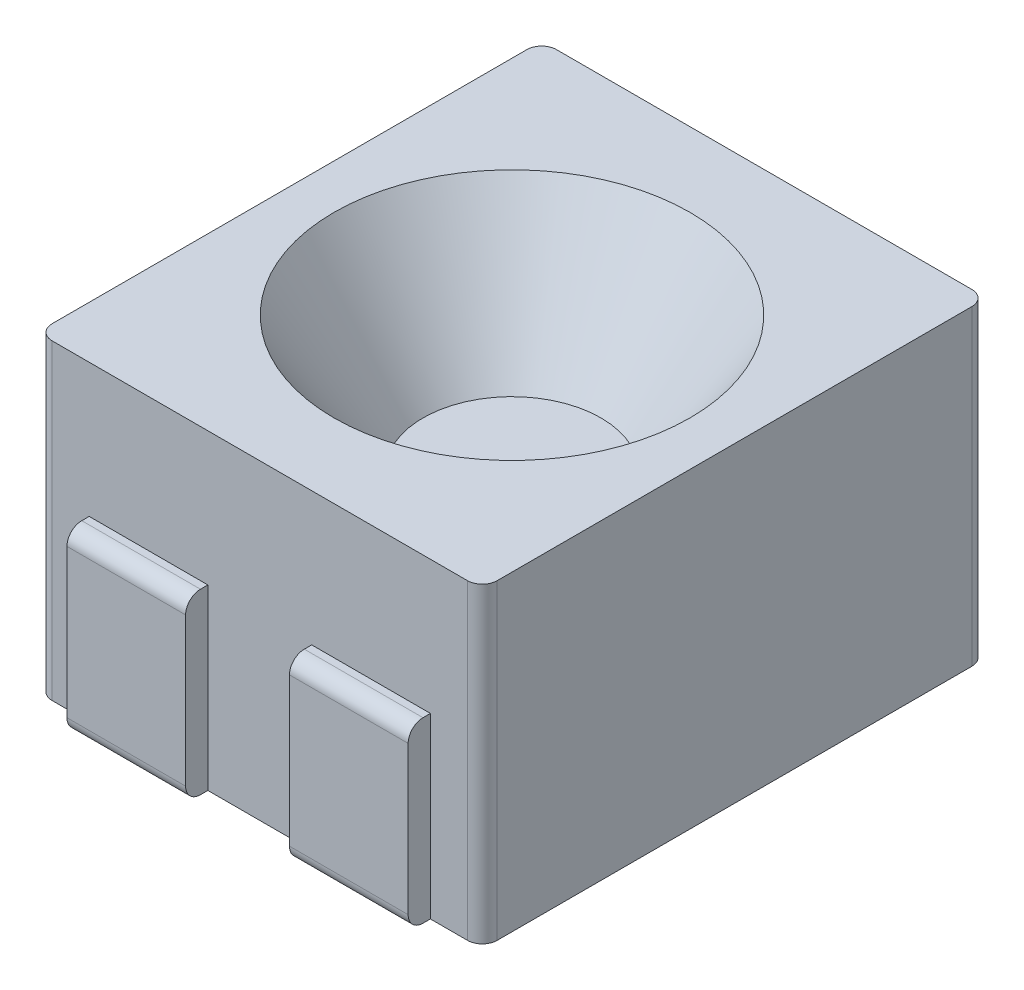
ISO-10303-21;
HEADER;
FILE_DESCRIPTION(('STEP AP214'),'2;1');
FILE_NAME('part.step','',(''),(''),'','','');
FILE_SCHEMA(('AUTOMOTIVE_DESIGN { 1 0 10303 214 1 1 1 1 }'));
ENDSEC;
DATA;
#1=APPLICATION_CONTEXT('core data for automotive mechanical design processes');
#2=APPLICATION_PROTOCOL_DEFINITION('international standard','automotive_design',2000,#1);
#3=PRODUCT_CONTEXT('',#1,'mechanical');
#4=PRODUCT('Part','Part','',(#3));
#5=PRODUCT_RELATED_PRODUCT_CATEGORY('part','',(#4));
#6=PRODUCT_DEFINITION_FORMATION('','',#4);
#7=PRODUCT_DEFINITION_CONTEXT('part definition',#1,'design');
#8=PRODUCT_DEFINITION('design','',#6,#7);
#9=PRODUCT_DEFINITION_SHAPE('','',#8);
#10=(LENGTH_UNIT() NAMED_UNIT(*) SI_UNIT(.MILLI.,.METRE.));
#11=(NAMED_UNIT(*) PLANE_ANGLE_UNIT() SI_UNIT($,.RADIAN.));
#12=(NAMED_UNIT(*) SI_UNIT($,.STERADIAN.) SOLID_ANGLE_UNIT());
#13=UNCERTAINTY_MEASURE_WITH_UNIT(LENGTH_MEASURE(1.E-05),#10,'distance_accuracy_value','');
#14=(GEOMETRIC_REPRESENTATION_CONTEXT(3) GLOBAL_UNCERTAINTY_ASSIGNED_CONTEXT((#13)) GLOBAL_UNIT_ASSIGNED_CONTEXT((#10,
#11,#12)) REPRESENTATION_CONTEXT('',''));
#15=CARTESIAN_POINT('',(0.,0.,0.));
#16=DIRECTION('',(0.,0.,1.));
#17=DIRECTION('',(1.,0.,0.));
#18=AXIS2_PLACEMENT_3D('',#15,#16,#17);
#19=CARTESIAN_POINT('',(-1.5,2.1,-1.7));
#20=DIRECTION('',(0.,0.,1.));
#21=DIRECTION('',(1.,0.,0.));
#22=AXIS2_PLACEMENT_3D('',#19,#20,#21);
#23=PLANE('',#22);
#24=DIRECTION('',(-1.,0.,0.));
#25=VECTOR('',#24,1.);
#26=CARTESIAN_POINT('',(-1.5,0.,-1.7));
#27=LINE('',#26,#25);
#28=CARTESIAN_POINT('',(-1.15,0.,-1.7));
#29=VERTEX_POINT('',#28);
#30=CARTESIAN_POINT('',(-1.4,0.,-1.7));
#31=VERTEX_POINT('',#30);
#32=EDGE_CURVE('E259',#29,#31,#27,.T.);
#33=ORIENTED_EDGE('',*,*,#32,.T.);
#34=DIRECTION('',(0.,-1.,0.));
#35=VECTOR('',#34,1.);
#36=CARTESIAN_POINT('',(-1.4,2.1,-1.7));
#37=LINE('',#36,#35);
#38=CARTESIAN_POINT('',(-1.4,2.1,-1.7));
#39=VERTEX_POINT('',#38);
#40=EDGE_CURVE('E502',#31,#39,#37,.F.);
#41=ORIENTED_EDGE('',*,*,#40,.T.);
#42=DIRECTION('',(-1.,0.,0.));
#43=VECTOR('',#42,1.);
#44=CARTESIAN_POINT('',(-1.5,2.1,-1.7));
#45=LINE('',#44,#43);
#46=CARTESIAN_POINT('',(1.4,2.1,-1.7));
#47=VERTEX_POINT('',#46);
#48=EDGE_CURVE('E446',#47,#39,#45,.T.);
#49=ORIENTED_EDGE('',*,*,#48,.F.);
#50=DIRECTION('',(0.,-1.,0.));
#51=VECTOR('',#50,1.);
#52=CARTESIAN_POINT('',(1.4,2.1,-1.7));
#53=LINE('',#52,#51);
#54=CARTESIAN_POINT('',(1.4,0.,-1.7));
#55=VERTEX_POINT('',#54);
#56=EDGE_CURVE('E518',#47,#55,#53,.T.);
#57=ORIENTED_EDGE('',*,*,#56,.T.);
#58=CARTESIAN_POINT('',(1.15,0.,-1.7));
#59=VERTEX_POINT('',#58);
#60=EDGE_CURVE('E330',#55,#59,#27,.T.);
#61=ORIENTED_EDGE('',*,*,#60,.T.);
#62=DIRECTION('',(0.,-1.,0.));
#63=VECTOR('',#62,1.);
#64=CARTESIAN_POINT('',(1.15,0.,-1.7));
#65=LINE('',#64,#63);
#66=CARTESIAN_POINT('',(1.15,1.2,-1.7));
#67=VERTEX_POINT('',#66);
#68=EDGE_CURVE('E289',#67,#59,#65,.T.);
#69=ORIENTED_EDGE('',*,*,#68,.F.);
#70=DIRECTION('',(1.,0.,0.));
#71=VECTOR('',#70,1.);
#72=CARTESIAN_POINT('',(1.15,1.2,-1.7));
#73=LINE('',#72,#71);
#74=CARTESIAN_POINT('',(0.35,1.2,-1.7));
#75=VERTEX_POINT('',#74);
#76=EDGE_CURVE('E294',#75,#67,#73,.T.);
#77=ORIENTED_EDGE('',*,*,#76,.F.);
#78=DIRECTION('',(0.,1.,0.));
#79=VECTOR('',#78,1.);
#80=CARTESIAN_POINT('',(0.35,0.,-1.7));
#81=LINE('',#80,#79);
#82=CARTESIAN_POINT('',(0.35,0.,-1.7));
#83=VERTEX_POINT('',#82);
#84=EDGE_CURVE('E305',#83,#75,#81,.T.);
#85=ORIENTED_EDGE('',*,*,#84,.F.);
#86=CARTESIAN_POINT('',(-0.35,0.,-1.7));
#87=VERTEX_POINT('',#86);
#88=EDGE_CURVE('E265',#83,#87,#27,.T.);
#89=ORIENTED_EDGE('',*,*,#88,.T.);
#90=DIRECTION('',(0.,1.,0.));
#91=VECTOR('',#90,1.);
#92=CARTESIAN_POINT('',(-0.35,0.,-1.7));
#93=LINE('',#92,#91);
#94=CARTESIAN_POINT('',(-0.35,1.2,-1.7));
#95=VERTEX_POINT('',#94);
#96=EDGE_CURVE('E274',#87,#95,#93,.T.);
#97=ORIENTED_EDGE('',*,*,#96,.T.);
#98=DIRECTION('',(-1.,0.,0.));
#99=VECTOR('',#98,1.);
#100=CARTESIAN_POINT('',(-1.15,1.2,-1.7));
#101=LINE('',#100,#99);
#102=CARTESIAN_POINT('',(-1.15,1.2,-1.7));
#103=VERTEX_POINT('',#102);
#104=EDGE_CURVE('E271',#95,#103,#101,.T.);
#105=ORIENTED_EDGE('',*,*,#104,.T.);
#106=DIRECTION('',(0.,-1.,0.));
#107=VECTOR('',#106,1.);
#108=CARTESIAN_POINT('',(-1.15,0.,-1.7));
#109=LINE('',#108,#107);
#110=EDGE_CURVE('E249',#103,#29,#109,.T.);
#111=ORIENTED_EDGE('',*,*,#110,.T.);
#112=EDGE_LOOP('',(#33,#41,#49,#57,#61,#69,#77,#85,#89,#97,#105,#111));
#113=FACE_BOUND('',#112,.T.);
#114=ADVANCED_FACE('F32',(#113),#23,.F.);
#115=CARTESIAN_POINT('',(-1.5,2.1,1.7));
#116=DIRECTION('',(0.,0.,-1.));
#117=DIRECTION('',(-1.,0.,0.));
#118=AXIS2_PLACEMENT_3D('',#115,#116,#117);
#119=PLANE('',#118);
#120=DIRECTION('',(1.,0.,0.));
#121=VECTOR('',#120,1.);
#122=CARTESIAN_POINT('',(-1.5,2.1,1.7));
#123=LINE('',#122,#121);
#124=CARTESIAN_POINT('',(-1.4,2.1,1.7));
#125=VERTEX_POINT('',#124);
#126=CARTESIAN_POINT('',(1.4,2.1,1.7));
#127=VERTEX_POINT('',#126);
#128=EDGE_CURVE('E486',#125,#127,#123,.T.);
#129=ORIENTED_EDGE('',*,*,#128,.F.);
#130=DIRECTION('',(0.,-1.,0.));
#131=VECTOR('',#130,1.);
#132=CARTESIAN_POINT('',(-1.4,2.1,1.7));
#133=LINE('',#132,#131);
#134=CARTESIAN_POINT('',(-1.4,0.,1.7));
#135=VERTEX_POINT('',#134);
#136=EDGE_CURVE('E11',#125,#135,#133,.T.);
#137=ORIENTED_EDGE('',*,*,#136,.T.);
#138=DIRECTION('',(1.,0.,0.));
#139=VECTOR('',#138,1.);
#140=CARTESIAN_POINT('',(-1.5,0.,1.7));
#141=LINE('',#140,#139);
#142=CARTESIAN_POINT('',(-1.15,0.,1.7));
#143=VERTEX_POINT('',#142);
#144=EDGE_CURVE('E368',#135,#143,#141,.T.);
#145=ORIENTED_EDGE('',*,*,#144,.T.);
#146=DIRECTION('',(0.,-1.,0.));
#147=VECTOR('',#146,1.);
#148=CARTESIAN_POINT('',(-1.15,0.,1.7));
#149=LINE('',#148,#147);
#150=CARTESIAN_POINT('',(-1.15,1.2,1.7));
#151=VERTEX_POINT('',#150);
#152=EDGE_CURVE('E418',#151,#143,#149,.T.);
#153=ORIENTED_EDGE('',*,*,#152,.F.);
#154=DIRECTION('',(-1.,0.,0.));
#155=VECTOR('',#154,1.);
#156=CARTESIAN_POINT('',(-1.15,1.2,1.7));
#157=LINE('',#156,#155);
#158=CARTESIAN_POINT('',(-0.35,1.2,1.7));
#159=VERTEX_POINT('',#158);
#160=EDGE_CURVE('E431',#159,#151,#157,.T.);
#161=ORIENTED_EDGE('',*,*,#160,.F.);
#162=DIRECTION('',(0.,1.,0.));
#163=VECTOR('',#162,1.);
#164=CARTESIAN_POINT('',(-0.35,0.,1.7));
#165=LINE('',#164,#163);
#166=CARTESIAN_POINT('',(-0.35,0.,1.7));
#167=VERTEX_POINT('',#166);
#168=EDGE_CURVE('E421',#167,#159,#165,.T.);
#169=ORIENTED_EDGE('',*,*,#168,.F.);
#170=CARTESIAN_POINT('',(0.35,0.,1.7));
#171=VERTEX_POINT('',#170);
#172=EDGE_CURVE('E336',#167,#171,#141,.T.);
#173=ORIENTED_EDGE('',*,*,#172,.T.);
#174=DIRECTION('',(0.,1.,0.));
#175=VECTOR('',#174,1.);
#176=CARTESIAN_POINT('',(0.35,0.,1.7));
#177=LINE('',#176,#175);
#178=CARTESIAN_POINT('',(0.35,1.2,1.7));
#179=VERTEX_POINT('',#178);
#180=EDGE_CURVE('E556',#171,#179,#177,.T.);
#181=ORIENTED_EDGE('',*,*,#180,.T.);
#182=DIRECTION('',(1.,0.,0.));
#183=VECTOR('',#182,1.);
#184=CARTESIAN_POINT('',(1.15,1.2,1.7));
#185=LINE('',#184,#183);
#186=CARTESIAN_POINT('',(1.15,1.2,1.7));
#187=VERTEX_POINT('',#186);
#188=EDGE_CURVE('E561',#179,#187,#185,.T.);
#189=ORIENTED_EDGE('',*,*,#188,.T.);
#190=DIRECTION('',(0.,-1.,0.));
#191=VECTOR('',#190,1.);
#192=CARTESIAN_POINT('',(1.15,0.,1.7));
#193=LINE('',#192,#191);
#194=CARTESIAN_POINT('',(1.15,0.,1.7));
#195=VERTEX_POINT('',#194);
#196=EDGE_CURVE('E417',#187,#195,#193,.T.);
#197=ORIENTED_EDGE('',*,*,#196,.T.);
#198=CARTESIAN_POINT('',(1.4,0.,1.7));
#199=VERTEX_POINT('',#198);
#200=EDGE_CURVE('E378',#195,#199,#141,.T.);
#201=ORIENTED_EDGE('',*,*,#200,.T.);
#202=DIRECTION('',(0.,-1.,0.));
#203=VECTOR('',#202,1.);
#204=CARTESIAN_POINT('',(1.4,2.1,1.7));
#205=LINE('',#204,#203);
#206=EDGE_CURVE('E40',#199,#127,#205,.F.);
#207=ORIENTED_EDGE('',*,*,#206,.T.);
#208=EDGE_LOOP('',(#129,#137,#145,#153,#161,#169,#173,#181,#189,#197,#201,#207));
#209=FACE_BOUND('',#208,.T.);
#210=ADVANCED_FACE('F471',(#209),#119,.F.);
#211=CARTESIAN_POINT('',(-1.5,2.1,1.7));
#212=DIRECTION('',(1.,0.,0.));
#213=DIRECTION('',(0.,0.,-1.));
#214=AXIS2_PLACEMENT_3D('',#211,#212,#213);
#215=PLANE('',#214);
#216=DIRECTION('',(0.,0.,1.));
#217=VECTOR('',#216,1.);
#218=CARTESIAN_POINT('',(-1.5,2.1,1.7));
#219=LINE('',#218,#217);
#220=CARTESIAN_POINT('',(-1.5,2.1,-1.6));
#221=VERTEX_POINT('',#220);
#222=CARTESIAN_POINT('',(-1.5,2.1,1.6));
#223=VERTEX_POINT('',#222);
#224=EDGE_CURVE('E367',#221,#223,#219,.T.);
#225=ORIENTED_EDGE('',*,*,#224,.F.);
#226=DIRECTION('',(0.,-1.,0.));
#227=VECTOR('',#226,1.);
#228=CARTESIAN_POINT('',(-1.5,2.1,-1.6));
#229=LINE('',#228,#227);
#230=CARTESIAN_POINT('',(-1.5,0.,-1.6));
#231=VERTEX_POINT('',#230);
#232=EDGE_CURVE('E363',#221,#231,#229,.T.);
#233=ORIENTED_EDGE('',*,*,#232,.T.);
#234=DIRECTION('',(0.,0.,1.));
#235=VECTOR('',#234,1.);
#236=CARTESIAN_POINT('',(-1.5,0.,1.7));
#237=LINE('',#236,#235);
#238=CARTESIAN_POINT('',(-1.5,0.,1.6));
#239=VERTEX_POINT('',#238);
#240=EDGE_CURVE('E373',#231,#239,#237,.T.);
#241=ORIENTED_EDGE('',*,*,#240,.T.);
#242=DIRECTION('',(0.,-1.,0.));
#243=VECTOR('',#242,1.);
#244=CARTESIAN_POINT('',(-1.5,2.1,1.6));
#245=LINE('',#244,#243);
#246=EDGE_CURVE('E361',#239,#223,#245,.F.);
#247=ORIENTED_EDGE('',*,*,#246,.T.);
#248=EDGE_LOOP('',(#225,#233,#241,#247));
#249=FACE_BOUND('',#248,.T.);
#250=ADVANCED_FACE('F593',(#249),#215,.F.);
#251=CARTESIAN_POINT('',(1.5,2.1,1.7));
#252=DIRECTION('',(-1.,0.,0.));
#253=DIRECTION('',(0.,0.,1.));
#254=AXIS2_PLACEMENT_3D('',#251,#252,#253);
#255=PLANE('',#254);
#256=DIRECTION('',(0.,0.,-1.));
#257=VECTOR('',#256,1.);
#258=CARTESIAN_POINT('',(1.5,0.,1.7));
#259=LINE('',#258,#257);
#260=CARTESIAN_POINT('',(1.5,0.,1.6));
#261=VERTEX_POINT('',#260);
#262=CARTESIAN_POINT('',(1.5,0.,-1.6));
#263=VERTEX_POINT('',#262);
#264=EDGE_CURVE('E266',#261,#263,#259,.T.);
#265=ORIENTED_EDGE('',*,*,#264,.T.);
#266=DIRECTION('',(0.,-1.,0.));
#267=VECTOR('',#266,1.);
#268=CARTESIAN_POINT('',(1.5,2.1,-1.6));
#269=LINE('',#268,#267);
#270=CARTESIAN_POINT('',(1.5,2.1,-1.6));
#271=VERTEX_POINT('',#270);
#272=EDGE_CURVE('E47',#263,#271,#269,.F.);
#273=ORIENTED_EDGE('',*,*,#272,.T.);
#274=DIRECTION('',(0.,0.,-1.));
#275=VECTOR('',#274,1.);
#276=CARTESIAN_POINT('',(1.5,2.1,1.7));
#277=LINE('',#276,#275);
#278=CARTESIAN_POINT('',(1.5,2.1,1.6));
#279=VERTEX_POINT('',#278);
#280=EDGE_CURVE('E488',#279,#271,#277,.T.);
#281=ORIENTED_EDGE('',*,*,#280,.F.);
#282=DIRECTION('',(0.,-1.,0.));
#283=VECTOR('',#282,1.);
#284=CARTESIAN_POINT('',(1.5,2.1,1.6));
#285=LINE('',#284,#283);
#286=EDGE_CURVE('E503',#279,#261,#285,.T.);
#287=ORIENTED_EDGE('',*,*,#286,.T.);
#288=EDGE_LOOP('',(#265,#273,#281,#287));
#289=FACE_BOUND('',#288,.T.);
#290=ADVANCED_FACE('F527',(#289),#255,.F.);
#291=CARTESIAN_POINT('',(-1.5,2.1,-1.7));
#292=DIRECTION('',(0.,-1.,0.));
#293=DIRECTION('',(0.,0.,-1.));
#294=AXIS2_PLACEMENT_3D('',#291,#292,#293);
#295=PLANE('',#294);
#296=CARTESIAN_POINT('',(0.,2.1,0.));
#297=DIRECTION('',(0.,1.,0.));
#298=DIRECTION('',(0.,0.,1.));
#299=AXIS2_PLACEMENT_3D('',#296,#297,#298);
#300=CIRCLE('',#299,1.2);
#301=CARTESIAN_POINT('',(0.,2.1,1.2));
#302=VERTEX_POINT('',#301);
#303=EDGE_CURVE('E277',#302,#302,#300,.T.);
#304=ORIENTED_EDGE('',*,*,#303,.F.);
#305=EDGE_LOOP('',(#304));
#306=FACE_BOUND('',#305,.T.);
#307=ORIENTED_EDGE('',*,*,#48,.T.);
#308=CARTESIAN_POINT('',(-1.4,2.1,-1.6));
#309=DIRECTION('',(0.,-1.,0.));
#310=DIRECTION('',(0.,0.,-1.));
#311=AXIS2_PLACEMENT_3D('',#308,#309,#310);
#312=CIRCLE('',#311,0.1);
#313=EDGE_CURVE('E493',#39,#221,#312,.F.);
#314=ORIENTED_EDGE('',*,*,#313,.T.);
#315=ORIENTED_EDGE('',*,*,#224,.T.);
#316=CARTESIAN_POINT('',(-1.4,2.1,1.6));
#317=DIRECTION('',(0.,-1.,0.));
#318=DIRECTION('',(0.,0.,-1.));
#319=AXIS2_PLACEMENT_3D('',#316,#317,#318);
#320=CIRCLE('',#319,0.1);
#321=EDGE_CURVE('E507',#223,#125,#320,.F.);
#322=ORIENTED_EDGE('',*,*,#321,.T.);
#323=ORIENTED_EDGE('',*,*,#128,.T.);
#324=CARTESIAN_POINT('',(1.4,2.1,1.6));
#325=DIRECTION('',(0.,-1.,0.));
#326=DIRECTION('',(0.,0.,-1.));
#327=AXIS2_PLACEMENT_3D('',#324,#325,#326);
#328=CIRCLE('',#327,0.1);
#329=EDGE_CURVE('E54',#127,#279,#328,.F.);
#330=ORIENTED_EDGE('',*,*,#329,.T.);
#331=ORIENTED_EDGE('',*,*,#280,.T.);
#332=CARTESIAN_POINT('',(1.4,2.1,-1.6));
#333=DIRECTION('',(0.,-1.,0.));
#334=DIRECTION('',(0.,0.,-1.));
#335=AXIS2_PLACEMENT_3D('',#332,#333,#334);
#336=CIRCLE('',#335,0.1);
#337=EDGE_CURVE('E496',#271,#47,#336,.F.);
#338=ORIENTED_EDGE('',*,*,#337,.T.);
#339=EDGE_LOOP('',(#307,#314,#315,#322,#323,#330,#331,#338));
#340=FACE_BOUND('',#339,.T.);
#341=ADVANCED_FACE('F492',(#306,#340),#295,.F.);
#342=CARTESIAN_POINT('',(-1.5,0.,-1.7));
#343=DIRECTION('',(0.,-1.,0.));
#344=DIRECTION('',(0.,0.,-1.));
#345=AXIS2_PLACEMENT_3D('',#342,#343,#344);
#346=PLANE('',#345);
#347=ORIENTED_EDGE('',*,*,#240,.F.);
#348=CARTESIAN_POINT('',(-1.4,0.,-1.6));
#349=DIRECTION('',(0.,-1.,0.));
#350=DIRECTION('',(0.,0.,-1.));
#351=AXIS2_PLACEMENT_3D('',#348,#349,#350);
#352=CIRCLE('',#351,0.1);
#353=EDGE_CURVE('E262',#231,#31,#352,.T.);
#354=ORIENTED_EDGE('',*,*,#353,.T.);
#355=ORIENTED_EDGE('',*,*,#32,.F.);
#356=DIRECTION('',(0.,0.,1.));
#357=VECTOR('',#356,1.);
#358=CARTESIAN_POINT('',(-1.15,0.,-1.85));
#359=LINE('',#358,#357);
#360=CARTESIAN_POINT('',(-1.15,0.,-1.75));
#361=VERTEX_POINT('',#360);
#362=EDGE_CURVE('E243',#361,#29,#359,.T.);
#363=ORIENTED_EDGE('',*,*,#362,.F.);
#364=DIRECTION('',(1.,0.,0.));
#365=VECTOR('',#364,1.);
#366=CARTESIAN_POINT('',(-0.35,0.,-1.75));
#367=LINE('',#366,#365);
#368=CARTESIAN_POINT('',(-0.35,0.,-1.75));
#369=VERTEX_POINT('',#368);
#370=EDGE_CURVE('E345',#361,#369,#367,.T.);
#371=ORIENTED_EDGE('',*,*,#370,.T.);
#372=DIRECTION('',(0.,0.,1.));
#373=VECTOR('',#372,1.);
#374=CARTESIAN_POINT('',(-0.35,0.,-1.85));
#375=LINE('',#374,#373);
#376=EDGE_CURVE('E255',#369,#87,#375,.T.);
#377=ORIENTED_EDGE('',*,*,#376,.T.);
#378=ORIENTED_EDGE('',*,*,#88,.F.);
#379=DIRECTION('',(0.,0.,1.));
#380=VECTOR('',#379,1.);
#381=CARTESIAN_POINT('',(0.35,0.,-1.85));
#382=LINE('',#381,#380);
#383=CARTESIAN_POINT('',(0.35,0.,-1.75));
#384=VERTEX_POINT('',#383);
#385=EDGE_CURVE('E316',#384,#83,#382,.T.);
#386=ORIENTED_EDGE('',*,*,#385,.F.);
#387=DIRECTION('',(-1.,0.,0.));
#388=VECTOR('',#387,1.);
#389=CARTESIAN_POINT('',(1.15,0.,-1.75));
#390=LINE('',#389,#388);
#391=CARTESIAN_POINT('',(1.15,0.,-1.75));
#392=VERTEX_POINT('',#391);
#393=EDGE_CURVE('E536',#384,#392,#390,.F.);
#394=ORIENTED_EDGE('',*,*,#393,.T.);
#395=DIRECTION('',(0.,0.,1.));
#396=VECTOR('',#395,1.);
#397=CARTESIAN_POINT('',(1.15,0.,-1.85));
#398=LINE('',#397,#396);
#399=EDGE_CURVE('E318',#392,#59,#398,.T.);
#400=ORIENTED_EDGE('',*,*,#399,.T.);
#401=ORIENTED_EDGE('',*,*,#60,.F.);
#402=CARTESIAN_POINT('',(1.4,0.,-1.6));
#403=DIRECTION('',(0.,-1.,0.));
#404=DIRECTION('',(0.,0.,-1.));
#405=AXIS2_PLACEMENT_3D('',#402,#403,#404);
#406=CIRCLE('',#405,0.1);
#407=EDGE_CURVE('E523',#55,#263,#406,.T.);
#408=ORIENTED_EDGE('',*,*,#407,.T.);
#409=ORIENTED_EDGE('',*,*,#264,.F.);
#410=CARTESIAN_POINT('',(1.4,0.,1.6));
#411=DIRECTION('',(0.,-1.,0.));
#412=DIRECTION('',(0.,0.,-1.));
#413=AXIS2_PLACEMENT_3D('',#410,#411,#412);
#414=CIRCLE('',#413,0.1);
#415=EDGE_CURVE('E365',#261,#199,#414,.T.);
#416=ORIENTED_EDGE('',*,*,#415,.T.);
#417=ORIENTED_EDGE('',*,*,#200,.F.);
#418=DIRECTION('',(0.,0.,-1.));
#419=VECTOR('',#418,1.);
#420=CARTESIAN_POINT('',(1.15,0.,1.85));
#421=LINE('',#420,#419);
#422=CARTESIAN_POINT('',(1.15,0.,1.75));
#423=VERTEX_POINT('',#422);
#424=EDGE_CURVE('E559',#423,#195,#421,.T.);
#425=ORIENTED_EDGE('',*,*,#424,.F.);
#426=DIRECTION('',(-1.,0.,0.));
#427=VECTOR('',#426,1.);
#428=CARTESIAN_POINT('',(0.35,0.,1.75));
#429=LINE('',#428,#427);
#430=CARTESIAN_POINT('',(0.35,0.,1.75));
#431=VERTEX_POINT('',#430);
#432=EDGE_CURVE('E384',#423,#431,#429,.T.);
#433=ORIENTED_EDGE('',*,*,#432,.T.);
#434=DIRECTION('',(0.,0.,-1.));
#435=VECTOR('',#434,1.);
#436=CARTESIAN_POINT('',(0.35,0.,1.85));
#437=LINE('',#436,#435);
#438=EDGE_CURVE('E423',#431,#171,#437,.T.);
#439=ORIENTED_EDGE('',*,*,#438,.T.);
#440=ORIENTED_EDGE('',*,*,#172,.F.);
#441=DIRECTION('',(0.,0.,-1.));
#442=VECTOR('',#441,1.);
#443=CARTESIAN_POINT('',(-0.35,0.,1.85));
#444=LINE('',#443,#442);
#445=CARTESIAN_POINT('',(-0.35,0.,1.75));
#446=VERTEX_POINT('',#445);
#447=EDGE_CURVE('E450',#446,#167,#444,.T.);
#448=ORIENTED_EDGE('',*,*,#447,.F.);
#449=DIRECTION('',(1.,0.,0.));
#450=VECTOR('',#449,1.);
#451=CARTESIAN_POINT('',(-1.15,0.,1.75));
#452=LINE('',#451,#450);
#453=CARTESIAN_POINT('',(-1.15,0.,1.75));
#454=VERTEX_POINT('',#453);
#455=EDGE_CURVE('E618',#446,#454,#452,.F.);
#456=ORIENTED_EDGE('',*,*,#455,.T.);
#457=DIRECTION('',(0.,0.,-1.));
#458=VECTOR('',#457,1.);
#459=CARTESIAN_POINT('',(-1.15,0.,1.85));
#460=LINE('',#459,#458);
#461=EDGE_CURVE('E452',#454,#143,#460,.T.);
#462=ORIENTED_EDGE('',*,*,#461,.T.);
#463=ORIENTED_EDGE('',*,*,#144,.F.);
#464=CARTESIAN_POINT('',(-1.4,0.,1.6));
#465=DIRECTION('',(0.,-1.,0.));
#466=DIRECTION('',(0.,0.,-1.));
#467=AXIS2_PLACEMENT_3D('',#464,#465,#466);
#468=CIRCLE('',#467,0.1);
#469=EDGE_CURVE('E524',#135,#239,#468,.T.);
#470=ORIENTED_EDGE('',*,*,#469,.T.);
#471=EDGE_LOOP('',(#347,#354,#355,#363,#371,#377,#378,#386,#394,#400,#401,#408,#409,#416,#417,
#425,#433,#439,#440,#448,#456,#462,#463,#470));
#472=FACE_BOUND('',#471,.T.);
#473=ADVANCED_FACE('F261',(#472),#346,.T.);
#474=CARTESIAN_POINT('',(-1.15,0.,1.85));
#475=DIRECTION('',(1.,0.,0.));
#476=DIRECTION('',(0.,1.,0.));
#477=AXIS2_PLACEMENT_3D('',#474,#475,#476);
#478=PLANE('',#477);
#479=ORIENTED_EDGE('',*,*,#461,.F.);
#480=CARTESIAN_POINT('',(-1.15,0.1,1.75));
#481=DIRECTION('',(1.,0.,0.));
#482=DIRECTION('',(0.,1.,0.));
#483=AXIS2_PLACEMENT_3D('',#480,#481,#482);
#484=CIRCLE('',#483,0.1);
#485=CARTESIAN_POINT('',(-1.15,0.1,1.85));
#486=VERTEX_POINT('',#485);
#487=EDGE_CURVE('E622',#454,#486,#484,.F.);
#488=ORIENTED_EDGE('',*,*,#487,.T.);
#489=DIRECTION('',(0.,-1.,0.));
#490=VECTOR('',#489,1.);
#491=CARTESIAN_POINT('',(-1.15,0.,1.85));
#492=LINE('',#491,#490);
#493=CARTESIAN_POINT('',(-1.15,1.1,1.85));
#494=VERTEX_POINT('',#493);
#495=EDGE_CURVE('E427',#494,#486,#492,.T.);
#496=ORIENTED_EDGE('',*,*,#495,.F.);
#497=CARTESIAN_POINT('',(-1.15,1.1,1.75));
#498=DIRECTION('',(1.,0.,0.));
#499=DIRECTION('',(0.,1.,0.));
#500=AXIS2_PLACEMENT_3D('',#497,#498,#499);
#501=CIRCLE('',#500,0.1);
#502=CARTESIAN_POINT('',(-1.15,1.2,1.75));
#503=VERTEX_POINT('',#502);
#504=EDGE_CURVE('E481',#494,#503,#501,.F.);
#505=ORIENTED_EDGE('',*,*,#504,.T.);
#506=DIRECTION('',(0.,0.,-1.));
#507=VECTOR('',#506,1.);
#508=CARTESIAN_POINT('',(-1.15,1.2,1.85));
#509=LINE('',#508,#507);
#510=EDGE_CURVE('E434',#503,#151,#509,.T.);
#511=ORIENTED_EDGE('',*,*,#510,.T.);
#512=ORIENTED_EDGE('',*,*,#152,.T.);
#513=EDGE_LOOP('',(#479,#488,#496,#505,#511,#512));
#514=FACE_BOUND('',#513,.T.);
#515=ADVANCED_FACE('F478',(#514),#478,.F.);
#516=CARTESIAN_POINT('',(-0.35,0.,1.85));
#517=DIRECTION('',(-1.,0.,0.));
#518=DIRECTION('',(0.,-1.,0.));
#519=AXIS2_PLACEMENT_3D('',#516,#517,#518);
#520=PLANE('',#519);
#521=DIRECTION('',(0.,1.,0.));
#522=VECTOR('',#521,1.);
#523=CARTESIAN_POINT('',(-0.35,0.,1.85));
#524=LINE('',#523,#522);
#525=CARTESIAN_POINT('',(-0.35,0.1,1.85));
#526=VERTEX_POINT('',#525);
#527=CARTESIAN_POINT('',(-0.35,1.1,1.85));
#528=VERTEX_POINT('',#527);
#529=EDGE_CURVE('E430',#526,#528,#524,.T.);
#530=ORIENTED_EDGE('',*,*,#529,.F.);
#531=CARTESIAN_POINT('',(-0.35,0.1,1.75));
#532=DIRECTION('',(-1.,0.,0.));
#533=DIRECTION('',(0.,-1.,0.));
#534=AXIS2_PLACEMENT_3D('',#531,#532,#533);
#535=CIRCLE('',#534,0.1);
#536=EDGE_CURVE('E617',#526,#446,#535,.F.);
#537=ORIENTED_EDGE('',*,*,#536,.T.);
#538=ORIENTED_EDGE('',*,*,#447,.T.);
#539=ORIENTED_EDGE('',*,*,#168,.T.);
#540=DIRECTION('',(0.,0.,-1.));
#541=VECTOR('',#540,1.);
#542=CARTESIAN_POINT('',(-0.35,1.2,1.85));
#543=LINE('',#542,#541);
#544=CARTESIAN_POINT('',(-0.35,1.2,1.75));
#545=VERTEX_POINT('',#544);
#546=EDGE_CURVE('E453',#545,#159,#543,.T.);
#547=ORIENTED_EDGE('',*,*,#546,.F.);
#548=CARTESIAN_POINT('',(-0.35,1.1,1.75));
#549=DIRECTION('',(-1.,0.,0.));
#550=DIRECTION('',(0.,-1.,0.));
#551=AXIS2_PLACEMENT_3D('',#548,#549,#550);
#552=CIRCLE('',#551,0.1);
#553=EDGE_CURVE('E449',#545,#528,#552,.F.);
#554=ORIENTED_EDGE('',*,*,#553,.T.);
#555=EDGE_LOOP('',(#530,#537,#538,#539,#547,#554));
#556=FACE_BOUND('',#555,.T.);
#557=ADVANCED_FACE('F623',(#556),#520,.F.);
#558=CARTESIAN_POINT('',(-1.15,1.2,1.85));
#559=DIRECTION('',(0.,-1.,0.));
#560=DIRECTION('',(0.,0.,-1.));
#561=AXIS2_PLACEMENT_3D('',#558,#559,#560);
#562=PLANE('',#561);
#563=ORIENTED_EDGE('',*,*,#510,.F.);
#564=DIRECTION('',(-1.,0.,0.));
#565=VECTOR('',#564,1.);
#566=CARTESIAN_POINT('',(-1.15,1.2,1.75));
#567=LINE('',#566,#565);
#568=EDGE_CURVE('E382',#503,#545,#567,.F.);
#569=ORIENTED_EDGE('',*,*,#568,.T.);
#570=ORIENTED_EDGE('',*,*,#546,.T.);
#571=ORIENTED_EDGE('',*,*,#160,.T.);
#572=EDGE_LOOP('',(#563,#569,#570,#571));
#573=FACE_BOUND('',#572,.T.);
#574=ADVANCED_FACE('F466',(#573),#562,.F.);
#575=CARTESIAN_POINT('',(-1.15,1.2,1.85));
#576=DIRECTION('',(0.,0.,-1.));
#577=DIRECTION('',(-1.,0.,0.));
#578=AXIS2_PLACEMENT_3D('',#575,#576,#577);
#579=PLANE('',#578);
#580=ORIENTED_EDGE('',*,*,#495,.T.);
#581=DIRECTION('',(1.,0.,0.));
#582=VECTOR('',#581,1.);
#583=CARTESIAN_POINT('',(-0.35,0.1,1.85));
#584=LINE('',#583,#582);
#585=EDGE_CURVE('E445',#486,#526,#584,.T.);
#586=ORIENTED_EDGE('',*,*,#585,.T.);
#587=ORIENTED_EDGE('',*,*,#529,.T.);
#588=DIRECTION('',(-1.,0.,0.));
#589=VECTOR('',#588,1.);
#590=CARTESIAN_POINT('',(-1.15,1.1,1.85));
#591=LINE('',#590,#589);
#592=EDGE_CURVE('E442',#528,#494,#591,.T.);
#593=ORIENTED_EDGE('',*,*,#592,.T.);
#594=EDGE_LOOP('',(#580,#586,#587,#593));
#595=FACE_BOUND('',#594,.T.);
#596=ADVANCED_FACE('F606',(#595),#579,.F.);
#597=CARTESIAN_POINT('',(-1.15,0.1,1.75));
#598=DIRECTION('',(-1.,0.,0.));
#599=DIRECTION('',(0.,0.,1.));
#600=AXIS2_PLACEMENT_3D('',#597,#598,#599);
#601=CYLINDRICAL_SURFACE('',#600,0.1);
#602=ORIENTED_EDGE('',*,*,#487,.F.);
#603=ORIENTED_EDGE('',*,*,#455,.F.);
#604=ORIENTED_EDGE('',*,*,#536,.F.);
#605=ORIENTED_EDGE('',*,*,#585,.F.);
#606=EDGE_LOOP('',(#602,#603,#604,#605));
#607=FACE_BOUND('',#606,.T.);
#608=ADVANCED_FACE('F603',(#607),#601,.T.);
#609=CARTESIAN_POINT('',(-1.15,1.1,1.75));
#610=DIRECTION('',(-1.,0.,0.));
#611=DIRECTION('',(0.,0.,1.));
#612=AXIS2_PLACEMENT_3D('',#609,#610,#611);
#613=CYLINDRICAL_SURFACE('',#612,0.1);
#614=ORIENTED_EDGE('',*,*,#553,.F.);
#615=ORIENTED_EDGE('',*,*,#568,.F.);
#616=ORIENTED_EDGE('',*,*,#504,.F.);
#617=ORIENTED_EDGE('',*,*,#592,.F.);
#618=EDGE_LOOP('',(#614,#615,#616,#617));
#619=FACE_BOUND('',#618,.T.);
#620=ADVANCED_FACE('F605',(#619),#613,.T.);
#621=CARTESIAN_POINT('',(1.15,0.,1.85));
#622=DIRECTION('',(1.,0.,0.));
#623=DIRECTION('',(0.,1.,0.));
#624=AXIS2_PLACEMENT_3D('',#621,#622,#623);
#625=PLANE('',#624);
#626=DIRECTION('',(0.,-1.,0.));
#627=VECTOR('',#626,1.);
#628=CARTESIAN_POINT('',(1.15,0.,1.85));
#629=LINE('',#628,#627);
#630=CARTESIAN_POINT('',(1.15,1.1,1.85));
#631=VERTEX_POINT('',#630);
#632=CARTESIAN_POINT('',(1.15,0.1,1.85));
#633=VERTEX_POINT('',#632);
#634=EDGE_CURVE('E553',#631,#633,#629,.T.);
#635=ORIENTED_EDGE('',*,*,#634,.T.);
#636=CARTESIAN_POINT('',(1.15,0.1,1.75));
#637=DIRECTION('',(1.,0.,0.));
#638=DIRECTION('',(0.,1.,0.));
#639=AXIS2_PLACEMENT_3D('',#636,#637,#638);
#640=CIRCLE('',#639,0.1);
#641=EDGE_CURVE('E396',#633,#423,#640,.T.);
#642=ORIENTED_EDGE('',*,*,#641,.T.);
#643=ORIENTED_EDGE('',*,*,#424,.T.);
#644=ORIENTED_EDGE('',*,*,#196,.F.);
#645=DIRECTION('',(0.,0.,-1.));
#646=VECTOR('',#645,1.);
#647=CARTESIAN_POINT('',(1.15,1.2,1.85));
#648=LINE('',#647,#646);
#649=CARTESIAN_POINT('',(1.15,1.2,1.75));
#650=VERTEX_POINT('',#649);
#651=EDGE_CURVE('E408',#650,#187,#648,.T.);
#652=ORIENTED_EDGE('',*,*,#651,.F.);
#653=CARTESIAN_POINT('',(1.15,1.1,1.75));
#654=DIRECTION('',(1.,0.,0.));
#655=DIRECTION('',(0.,1.,0.));
#656=AXIS2_PLACEMENT_3D('',#653,#654,#655);
#657=CIRCLE('',#656,0.1);
#658=EDGE_CURVE('E395',#650,#631,#657,.T.);
#659=ORIENTED_EDGE('',*,*,#658,.T.);
#660=EDGE_LOOP('',(#635,#642,#643,#644,#652,#659));
#661=FACE_BOUND('',#660,.T.);
#662=ADVANCED_FACE('F414',(#661),#625,.T.);
#663=CARTESIAN_POINT('',(1.15,1.2,1.85));
#664=DIRECTION('',(0.,1.,0.));
#665=DIRECTION('',(0.,0.,1.));
#666=AXIS2_PLACEMENT_3D('',#663,#664,#665);
#667=PLANE('',#666);
#668=DIRECTION('',(0.,0.,-1.));
#669=VECTOR('',#668,1.);
#670=CARTESIAN_POINT('',(0.35,1.2,1.85));
#671=LINE('',#670,#669);
#672=CARTESIAN_POINT('',(0.35,1.2,1.75));
#673=VERTEX_POINT('',#672);
#674=EDGE_CURVE('E410',#673,#179,#671,.T.);
#675=ORIENTED_EDGE('',*,*,#674,.F.);
#676=DIRECTION('',(1.,0.,0.));
#677=VECTOR('',#676,1.);
#678=CARTESIAN_POINT('',(1.15,1.2,1.75));
#679=LINE('',#678,#677);
#680=EDGE_CURVE('E312',#673,#650,#679,.T.);
#681=ORIENTED_EDGE('',*,*,#680,.T.);
#682=ORIENTED_EDGE('',*,*,#651,.T.);
#683=ORIENTED_EDGE('',*,*,#188,.F.);
#684=EDGE_LOOP('',(#675,#681,#682,#683));
#685=FACE_BOUND('',#684,.T.);
#686=ADVANCED_FACE('F406',(#685),#667,.T.);
#687=CARTESIAN_POINT('',(0.35,0.,1.85));
#688=DIRECTION('',(-1.,0.,0.));
#689=DIRECTION('',(0.,-1.,0.));
#690=AXIS2_PLACEMENT_3D('',#687,#688,#689);
#691=PLANE('',#690);
#692=ORIENTED_EDGE('',*,*,#438,.F.);
#693=CARTESIAN_POINT('',(0.35,0.1,1.75));
#694=DIRECTION('',(-1.,0.,0.));
#695=DIRECTION('',(0.,-1.,0.));
#696=AXIS2_PLACEMENT_3D('',#693,#694,#695);
#697=CIRCLE('',#696,0.1);
#698=CARTESIAN_POINT('',(0.35,0.1,1.85));
#699=VERTEX_POINT('',#698);
#700=EDGE_CURVE('E389',#431,#699,#697,.T.);
#701=ORIENTED_EDGE('',*,*,#700,.T.);
#702=DIRECTION('',(0.,1.,0.));
#703=VECTOR('',#702,1.);
#704=CARTESIAN_POINT('',(0.35,0.,1.85));
#705=LINE('',#704,#703);
#706=CARTESIAN_POINT('',(0.35,1.1,1.85));
#707=VERTEX_POINT('',#706);
#708=EDGE_CURVE('E555',#699,#707,#705,.T.);
#709=ORIENTED_EDGE('',*,*,#708,.T.);
#710=CARTESIAN_POINT('',(0.35,1.1,1.75));
#711=DIRECTION('',(-1.,0.,0.));
#712=DIRECTION('',(0.,-1.,0.));
#713=AXIS2_PLACEMENT_3D('',#710,#711,#712);
#714=CIRCLE('',#713,0.1);
#715=EDGE_CURVE('E387',#707,#673,#714,.T.);
#716=ORIENTED_EDGE('',*,*,#715,.T.);
#717=ORIENTED_EDGE('',*,*,#674,.T.);
#718=ORIENTED_EDGE('',*,*,#180,.F.);
#719=EDGE_LOOP('',(#692,#701,#709,#716,#717,#718));
#720=FACE_BOUND('',#719,.T.);
#721=ADVANCED_FACE('F570',(#720),#691,.T.);
#722=CARTESIAN_POINT('',(1.15,1.2,1.85));
#723=DIRECTION('',(0.,0.,-1.));
#724=DIRECTION('',(1.,0.,0.));
#725=AXIS2_PLACEMENT_3D('',#722,#723,#724);
#726=PLANE('',#725);
#727=ORIENTED_EDGE('',*,*,#708,.F.);
#728=DIRECTION('',(-1.,0.,0.));
#729=VECTOR('',#728,1.);
#730=CARTESIAN_POINT('',(1.15,0.1,1.85));
#731=LINE('',#730,#729);
#732=EDGE_CURVE('E393',#699,#633,#731,.F.);
#733=ORIENTED_EDGE('',*,*,#732,.T.);
#734=ORIENTED_EDGE('',*,*,#634,.F.);
#735=DIRECTION('',(1.,0.,0.));
#736=VECTOR('',#735,1.);
#737=CARTESIAN_POINT('',(0.35,1.1,1.85));
#738=LINE('',#737,#736);
#739=EDGE_CURVE('E391',#631,#707,#738,.F.);
#740=ORIENTED_EDGE('',*,*,#739,.T.);
#741=EDGE_LOOP('',(#727,#733,#734,#740));
#742=FACE_BOUND('',#741,.T.);
#743=ADVANCED_FACE('F575',(#742),#726,.F.);
#744=CARTESIAN_POINT('',(-1.5,0.1,1.75));
#745=DIRECTION('',(1.,0.,0.));
#746=DIRECTION('',(0.,0.,-1.));
#747=AXIS2_PLACEMENT_3D('',#744,#745,#746);
#748=CYLINDRICAL_SURFACE('',#747,0.1);
#749=ORIENTED_EDGE('',*,*,#641,.F.);
#750=ORIENTED_EDGE('',*,*,#732,.F.);
#751=ORIENTED_EDGE('',*,*,#700,.F.);
#752=ORIENTED_EDGE('',*,*,#432,.F.);
#753=EDGE_LOOP('',(#749,#750,#751,#752));
#754=FACE_BOUND('',#753,.T.);
#755=ADVANCED_FACE('F578',(#754),#748,.T.);
#756=CARTESIAN_POINT('',(1.15,1.1,1.75));
#757=DIRECTION('',(-1.,0.,0.));
#758=DIRECTION('',(0.,0.,1.));
#759=AXIS2_PLACEMENT_3D('',#756,#757,#758);
#760=CYLINDRICAL_SURFACE('',#759,0.1);
#761=ORIENTED_EDGE('',*,*,#715,.F.);
#762=ORIENTED_EDGE('',*,*,#739,.F.);
#763=ORIENTED_EDGE('',*,*,#658,.F.);
#764=ORIENTED_EDGE('',*,*,#680,.F.);
#765=EDGE_LOOP('',(#761,#762,#763,#764));
#766=FACE_BOUND('',#765,.T.);
#767=ADVANCED_FACE('F573',(#766),#760,.T.);
#768=CARTESIAN_POINT('',(1.15,0.,-1.85));
#769=DIRECTION('',(-1.,0.,0.));
#770=DIRECTION('',(0.,-1.,0.));
#771=AXIS2_PLACEMENT_3D('',#768,#769,#770);
#772=PLANE('',#771);
#773=ORIENTED_EDGE('',*,*,#399,.F.);
#774=CARTESIAN_POINT('',(1.15,0.1,-1.75));
#775=DIRECTION('',(-1.,0.,0.));
#776=DIRECTION('',(0.,-1.,0.));
#777=AXIS2_PLACEMENT_3D('',#774,#775,#776);
#778=CIRCLE('',#777,0.1);
#779=CARTESIAN_POINT('',(1.15,0.1,-1.85));
#780=VERTEX_POINT('',#779);
#781=EDGE_CURVE('E667',#392,#780,#778,.F.);
#782=ORIENTED_EDGE('',*,*,#781,.T.);
#783=DIRECTION('',(0.,-1.,0.));
#784=VECTOR('',#783,1.);
#785=CARTESIAN_POINT('',(1.15,0.,-1.85));
#786=LINE('',#785,#784);
#787=CARTESIAN_POINT('',(1.15,1.1,-1.85));
#788=VERTEX_POINT('',#787);
#789=EDGE_CURVE('E290',#788,#780,#786,.T.);
#790=ORIENTED_EDGE('',*,*,#789,.F.);
#791=CARTESIAN_POINT('',(1.15,1.1,-1.75));
#792=DIRECTION('',(-1.,0.,0.));
#793=DIRECTION('',(0.,-1.,0.));
#794=AXIS2_PLACEMENT_3D('',#791,#792,#793);
#795=CIRCLE('',#794,0.1);
#796=CARTESIAN_POINT('',(1.15,1.2,-1.75));
#797=VERTEX_POINT('',#796);
#798=EDGE_CURVE('E668',#788,#797,#795,.F.);
#799=ORIENTED_EDGE('',*,*,#798,.T.);
#800=DIRECTION('',(0.,0.,1.));
#801=VECTOR('',#800,1.);
#802=CARTESIAN_POINT('',(1.15,1.2,-1.85));
#803=LINE('',#802,#801);
#804=EDGE_CURVE('E297',#797,#67,#803,.T.);
#805=ORIENTED_EDGE('',*,*,#804,.T.);
#806=ORIENTED_EDGE('',*,*,#68,.T.);
#807=EDGE_LOOP('',(#773,#782,#790,#799,#805,#806));
#808=FACE_BOUND('',#807,.T.);
#809=ADVANCED_FACE('F540',(#808),#772,.F.);
#810=CARTESIAN_POINT('',(0.35,0.,-1.85));
#811=DIRECTION('',(1.,0.,0.));
#812=DIRECTION('',(0.,1.,0.));
#813=AXIS2_PLACEMENT_3D('',#810,#811,#812);
#814=PLANE('',#813);
#815=DIRECTION('',(0.,1.,0.));
#816=VECTOR('',#815,1.);
#817=CARTESIAN_POINT('',(0.35,0.,-1.85));
#818=LINE('',#817,#816);
#819=CARTESIAN_POINT('',(0.35,0.1,-1.85));
#820=VERTEX_POINT('',#819);
#821=CARTESIAN_POINT('',(0.35,1.1,-1.85));
#822=VERTEX_POINT('',#821);
#823=EDGE_CURVE('E293',#820,#822,#818,.T.);
#824=ORIENTED_EDGE('',*,*,#823,.F.);
#825=CARTESIAN_POINT('',(0.35,0.1,-1.75));
#826=DIRECTION('',(1.,0.,0.));
#827=DIRECTION('',(0.,1.,0.));
#828=AXIS2_PLACEMENT_3D('',#825,#826,#827);
#829=CIRCLE('',#828,0.1);
#830=EDGE_CURVE('E666',#820,#384,#829,.F.);
#831=ORIENTED_EDGE('',*,*,#830,.T.);
#832=ORIENTED_EDGE('',*,*,#385,.T.);
#833=ORIENTED_EDGE('',*,*,#84,.T.);
#834=DIRECTION('',(0.,0.,1.));
#835=VECTOR('',#834,1.);
#836=CARTESIAN_POINT('',(0.35,1.2,-1.85));
#837=LINE('',#836,#835);
#838=CARTESIAN_POINT('',(0.35,1.2,-1.75));
#839=VERTEX_POINT('',#838);
#840=EDGE_CURVE('E319',#839,#75,#837,.T.);
#841=ORIENTED_EDGE('',*,*,#840,.F.);
#842=CARTESIAN_POINT('',(0.35,1.1,-1.75));
#843=DIRECTION('',(1.,0.,0.));
#844=DIRECTION('',(0.,1.,0.));
#845=AXIS2_PLACEMENT_3D('',#842,#843,#844);
#846=CIRCLE('',#845,0.1);
#847=EDGE_CURVE('E315',#839,#822,#846,.F.);
#848=ORIENTED_EDGE('',*,*,#847,.T.);
#849=EDGE_LOOP('',(#824,#831,#832,#833,#841,#848));
#850=FACE_BOUND('',#849,.T.);
#851=ADVANCED_FACE('F678',(#850),#814,.F.);
#852=CARTESIAN_POINT('',(1.15,1.2,-1.85));
#853=DIRECTION('',(0.,-1.,0.));
#854=DIRECTION('',(0.,0.,-1.));
#855=AXIS2_PLACEMENT_3D('',#852,#853,#854);
#856=PLANE('',#855);
#857=ORIENTED_EDGE('',*,*,#804,.F.);
#858=DIRECTION('',(1.,0.,0.));
#859=VECTOR('',#858,1.);
#860=CARTESIAN_POINT('',(1.15,1.2,-1.75));
#861=LINE('',#860,#859);
#862=EDGE_CURVE('E343',#797,#839,#861,.F.);
#863=ORIENTED_EDGE('',*,*,#862,.T.);
#864=ORIENTED_EDGE('',*,*,#840,.T.);
#865=ORIENTED_EDGE('',*,*,#76,.T.);
#866=EDGE_LOOP('',(#857,#863,#864,#865));
#867=FACE_BOUND('',#866,.T.);
#868=ADVANCED_FACE('F546',(#867),#856,.F.);
#869=CARTESIAN_POINT('',(1.15,1.2,-1.85));
#870=DIRECTION('',(0.,0.,1.));
#871=DIRECTION('',(1.,0.,0.));
#872=AXIS2_PLACEMENT_3D('',#869,#870,#871);
#873=PLANE('',#872);
#874=ORIENTED_EDGE('',*,*,#789,.T.);
#875=DIRECTION('',(-1.,0.,0.));
#876=VECTOR('',#875,1.);
#877=CARTESIAN_POINT('',(0.35,0.1,-1.85));
#878=LINE('',#877,#876);
#879=EDGE_CURVE('E311',#780,#820,#878,.T.);
#880=ORIENTED_EDGE('',*,*,#879,.T.);
#881=ORIENTED_EDGE('',*,*,#823,.T.);
#882=DIRECTION('',(1.,0.,0.));
#883=VECTOR('',#882,1.);
#884=CARTESIAN_POINT('',(1.15,1.1,-1.85));
#885=LINE('',#884,#883);
#886=EDGE_CURVE('E308',#822,#788,#885,.T.);
#887=ORIENTED_EDGE('',*,*,#886,.T.);
#888=EDGE_LOOP('',(#874,#880,#881,#887));
#889=FACE_BOUND('',#888,.T.);
#890=ADVANCED_FACE('F673',(#889),#873,.F.);
#891=CARTESIAN_POINT('',(1.15,0.1,-1.75));
#892=DIRECTION('',(1.,0.,0.));
#893=DIRECTION('',(0.,0.,-1.));
#894=AXIS2_PLACEMENT_3D('',#891,#892,#893);
#895=CYLINDRICAL_SURFACE('',#894,0.1);
#896=ORIENTED_EDGE('',*,*,#781,.F.);
#897=ORIENTED_EDGE('',*,*,#393,.F.);
#898=ORIENTED_EDGE('',*,*,#830,.F.);
#899=ORIENTED_EDGE('',*,*,#879,.F.);
#900=EDGE_LOOP('',(#896,#897,#898,#899));
#901=FACE_BOUND('',#900,.T.);
#902=ADVANCED_FACE('F664',(#901),#895,.T.);
#903=CARTESIAN_POINT('',(1.15,1.1,-1.75));
#904=DIRECTION('',(1.,0.,0.));
#905=DIRECTION('',(0.,0.,-1.));
#906=AXIS2_PLACEMENT_3D('',#903,#904,#905);
#907=CYLINDRICAL_SURFACE('',#906,0.1);
#908=ORIENTED_EDGE('',*,*,#847,.F.);
#909=ORIENTED_EDGE('',*,*,#862,.F.);
#910=ORIENTED_EDGE('',*,*,#798,.F.);
#911=ORIENTED_EDGE('',*,*,#886,.F.);
#912=EDGE_LOOP('',(#908,#909,#910,#911));
#913=FACE_BOUND('',#912,.T.);
#914=ADVANCED_FACE('F677',(#913),#907,.T.);
#915=CARTESIAN_POINT('',(-1.15,0.,-1.85));
#916=DIRECTION('',(-1.,0.,0.));
#917=DIRECTION('',(0.,-1.,0.));
#918=AXIS2_PLACEMENT_3D('',#915,#916,#917);
#919=PLANE('',#918);
#920=DIRECTION('',(0.,-1.,0.));
#921=VECTOR('',#920,1.);
#922=CARTESIAN_POINT('',(-1.15,0.,-1.85));
#923=LINE('',#922,#921);
#924=CARTESIAN_POINT('',(-1.15,1.1,-1.85));
#925=VERTEX_POINT('',#924);
#926=CARTESIAN_POINT('',(-1.15,0.1,-1.85));
#927=VERTEX_POINT('',#926);
#928=EDGE_CURVE('E282',#925,#927,#923,.T.);
#929=ORIENTED_EDGE('',*,*,#928,.T.);
#930=CARTESIAN_POINT('',(-1.15,0.1,-1.75));
#931=DIRECTION('',(-1.,0.,0.));
#932=DIRECTION('',(0.,-1.,0.));
#933=AXIS2_PLACEMENT_3D('',#930,#931,#932);
#934=CIRCLE('',#933,0.1);
#935=EDGE_CURVE('E251',#927,#361,#934,.T.);
#936=ORIENTED_EDGE('',*,*,#935,.T.);
#937=ORIENTED_EDGE('',*,*,#362,.T.);
#938=ORIENTED_EDGE('',*,*,#110,.F.);
#939=DIRECTION('',(0.,0.,1.));
#940=VECTOR('',#939,1.);
#941=CARTESIAN_POINT('',(-1.15,1.2,-1.85));
#942=LINE('',#941,#940);
#943=CARTESIAN_POINT('',(-1.15,1.2,-1.75));
#944=VERTEX_POINT('',#943);
#945=EDGE_CURVE('E287',#944,#103,#942,.T.);
#946=ORIENTED_EDGE('',*,*,#945,.F.);
#947=CARTESIAN_POINT('',(-1.15,1.1,-1.75));
#948=DIRECTION('',(-1.,0.,0.));
#949=DIRECTION('',(0.,-1.,0.));
#950=AXIS2_PLACEMENT_3D('',#947,#948,#949);
#951=CIRCLE('',#950,0.1);
#952=EDGE_CURVE('E355',#944,#925,#951,.T.);
#953=ORIENTED_EDGE('',*,*,#952,.T.);
#954=EDGE_LOOP('',(#929,#936,#937,#938,#946,#953));
#955=FACE_BOUND('',#954,.T.);
#956=ADVANCED_FACE('F246',(#955),#919,.T.);
#957=CARTESIAN_POINT('',(-1.15,1.2,-1.85));
#958=DIRECTION('',(0.,1.,0.));
#959=DIRECTION('',(0.,0.,1.));
#960=AXIS2_PLACEMENT_3D('',#957,#958,#959);
#961=PLANE('',#960);
#962=DIRECTION('',(0.,0.,1.));
#963=VECTOR('',#962,1.);
#964=CARTESIAN_POINT('',(-0.35,1.2,-1.85));
#965=LINE('',#964,#963);
#966=CARTESIAN_POINT('',(-0.35,1.2,-1.75));
#967=VERTEX_POINT('',#966);
#968=EDGE_CURVE('E285',#967,#95,#965,.T.);
#969=ORIENTED_EDGE('',*,*,#968,.F.);
#970=DIRECTION('',(-1.,0.,0.));
#971=VECTOR('',#970,1.);
#972=CARTESIAN_POINT('',(-1.15,1.2,-1.75));
#973=LINE('',#972,#971);
#974=EDGE_CURVE('E358',#967,#944,#973,.T.);
#975=ORIENTED_EDGE('',*,*,#974,.T.);
#976=ORIENTED_EDGE('',*,*,#945,.T.);
#977=ORIENTED_EDGE('',*,*,#104,.F.);
#978=EDGE_LOOP('',(#969,#975,#976,#977));
#979=FACE_BOUND('',#978,.T.);
#980=ADVANCED_FACE('F657',(#979),#961,.T.);
#981=CARTESIAN_POINT('',(-0.35,0.,-1.85));
#982=DIRECTION('',(1.,0.,0.));
#983=DIRECTION('',(0.,1.,0.));
#984=AXIS2_PLACEMENT_3D('',#981,#982,#983);
#985=PLANE('',#984);
#986=ORIENTED_EDGE('',*,*,#376,.F.);
#987=CARTESIAN_POINT('',(-0.35,0.1,-1.75));
#988=DIRECTION('',(1.,0.,0.));
#989=DIRECTION('',(0.,1.,0.));
#990=AXIS2_PLACEMENT_3D('',#987,#988,#989);
#991=CIRCLE('',#990,0.1);
#992=CARTESIAN_POINT('',(-0.35,0.1,-1.85));
#993=VERTEX_POINT('',#992);
#994=EDGE_CURVE('E349',#369,#993,#991,.T.);
#995=ORIENTED_EDGE('',*,*,#994,.T.);
#996=DIRECTION('',(0.,1.,0.));
#997=VECTOR('',#996,1.);
#998=CARTESIAN_POINT('',(-0.35,0.,-1.85));
#999=LINE('',#998,#997);
#1000=CARTESIAN_POINT('',(-0.35,1.1,-1.85));
#1001=VERTEX_POINT('',#1000);
#1002=EDGE_CURVE('E256',#993,#1001,#999,.T.);
#1003=ORIENTED_EDGE('',*,*,#1002,.T.);
#1004=CARTESIAN_POINT('',(-0.35,1.1,-1.75));
#1005=DIRECTION('',(1.,0.,0.));
#1006=DIRECTION('',(0.,1.,0.));
#1007=AXIS2_PLACEMENT_3D('',#1004,#1005,#1006);
#1008=CIRCLE('',#1007,0.1);
#1009=EDGE_CURVE('E347',#1001,#967,#1008,.T.);
#1010=ORIENTED_EDGE('',*,*,#1009,.T.);
#1011=ORIENTED_EDGE('',*,*,#968,.T.);
#1012=ORIENTED_EDGE('',*,*,#96,.F.);
#1013=EDGE_LOOP('',(#986,#995,#1003,#1010,#1011,#1012));
#1014=FACE_BOUND('',#1013,.T.);
#1015=ADVANCED_FACE('F648',(#1014),#985,.T.);
#1016=CARTESIAN_POINT('',(-1.15,1.2,-1.85));
#1017=DIRECTION('',(0.,0.,1.));
#1018=DIRECTION('',(-1.,0.,0.));
#1019=AXIS2_PLACEMENT_3D('',#1016,#1017,#1018);
#1020=PLANE('',#1019);
#1021=ORIENTED_EDGE('',*,*,#1002,.F.);
#1022=DIRECTION('',(1.,0.,0.));
#1023=VECTOR('',#1022,1.);
#1024=CARTESIAN_POINT('',(-1.15,0.1,-1.85));
#1025=LINE('',#1024,#1023);
#1026=EDGE_CURVE('E353',#993,#927,#1025,.F.);
#1027=ORIENTED_EDGE('',*,*,#1026,.T.);
#1028=ORIENTED_EDGE('',*,*,#928,.F.);
#1029=DIRECTION('',(-1.,0.,0.));
#1030=VECTOR('',#1029,1.);
#1031=CARTESIAN_POINT('',(-0.35,1.1,-1.85));
#1032=LINE('',#1031,#1030);
#1033=EDGE_CURVE('E351',#925,#1001,#1032,.F.);
#1034=ORIENTED_EDGE('',*,*,#1033,.T.);
#1035=EDGE_LOOP('',(#1021,#1027,#1028,#1034));
#1036=FACE_BOUND('',#1035,.T.);
#1037=ADVANCED_FACE('F658',(#1036),#1020,.F.);
#1038=CARTESIAN_POINT('',(-1.5,0.1,-1.75));
#1039=DIRECTION('',(-1.,0.,0.));
#1040=DIRECTION('',(0.,0.,1.));
#1041=AXIS2_PLACEMENT_3D('',#1038,#1039,#1040);
#1042=CYLINDRICAL_SURFACE('',#1041,0.1);
#1043=ORIENTED_EDGE('',*,*,#935,.F.);
#1044=ORIENTED_EDGE('',*,*,#1026,.F.);
#1045=ORIENTED_EDGE('',*,*,#994,.F.);
#1046=ORIENTED_EDGE('',*,*,#370,.F.);
#1047=EDGE_LOOP('',(#1043,#1044,#1045,#1046));
#1048=FACE_BOUND('',#1047,.T.);
#1049=ADVANCED_FACE('F660',(#1048),#1042,.T.);
#1050=CARTESIAN_POINT('',(-1.15,1.1,-1.75));
#1051=DIRECTION('',(1.,0.,0.));
#1052=DIRECTION('',(0.,0.,-1.));
#1053=AXIS2_PLACEMENT_3D('',#1050,#1051,#1052);
#1054=CYLINDRICAL_SURFACE('',#1053,0.1);
#1055=ORIENTED_EDGE('',*,*,#1009,.F.);
#1056=ORIENTED_EDGE('',*,*,#1033,.F.);
#1057=ORIENTED_EDGE('',*,*,#952,.F.);
#1058=ORIENTED_EDGE('',*,*,#974,.F.);
#1059=EDGE_LOOP('',(#1055,#1056,#1057,#1058));
#1060=FACE_BOUND('',#1059,.T.);
#1061=ADVANCED_FACE('F655',(#1060),#1054,.T.);
#1062=CARTESIAN_POINT('',(0.,1.2,0.));
#1063=DIRECTION('',(0.,-1.,0.));
#1064=DIRECTION('',(0.,0.,-1.));
#1065=AXIS2_PLACEMENT_3D('',#1062,#1063,#1064);
#1066=PLANE('',#1065);
#1067=CARTESIAN_POINT('',(0.,1.2,0.));
#1068=DIRECTION('',(0.,1.,0.));
#1069=DIRECTION('',(0.,0.,1.));
#1070=AXIS2_PLACEMENT_3D('',#1067,#1068,#1069);
#1071=CIRCLE('',#1070,0.6);
#1072=CARTESIAN_POINT('',(0.,1.2,0.6));
#1073=VERTEX_POINT('',#1072);
#1074=EDGE_CURVE('E272',#1073,#1073,#1071,.T.);
#1075=ORIENTED_EDGE('',*,*,#1074,.T.);
#1076=EDGE_LOOP('',(#1075));
#1077=FACE_BOUND('',#1076,.T.);
#1078=ADVANCED_FACE('F834',(#1077),#1066,.F.);
#1079=CARTESIAN_POINT('',(0.,2.1,0.));
#1080=DIRECTION('',(0.,1.,0.));
#1081=DIRECTION('',(0.,0.,1.));
#1082=AXIS2_PLACEMENT_3D('',#1079,#1080,#1081);
#1083=CONICAL_SURFACE('',#1082,1.2,0.588002603547567);
#1084=ORIENTED_EDGE('',*,*,#1074,.F.);
#1085=EDGE_LOOP('',(#1084));
#1086=FACE_BOUND('',#1085,.T.);
#1087=ORIENTED_EDGE('',*,*,#303,.T.);
#1088=EDGE_LOOP('',(#1087));
#1089=FACE_BOUND('',#1088,.T.);
#1090=ADVANCED_FACE('F843',(#1086,#1089),#1083,.F.);
#1091=CARTESIAN_POINT('',(-1.4,2.1,-1.6));
#1092=DIRECTION('',(0.,-1.,0.));
#1093=DIRECTION('',(0.,0.,-1.));
#1094=AXIS2_PLACEMENT_3D('',#1091,#1092,#1093);
#1095=CYLINDRICAL_SURFACE('',#1094,0.1);
#1096=ORIENTED_EDGE('',*,*,#313,.F.);
#1097=ORIENTED_EDGE('',*,*,#40,.F.);
#1098=ORIENTED_EDGE('',*,*,#353,.F.);
#1099=ORIENTED_EDGE('',*,*,#232,.F.);
#1100=EDGE_LOOP('',(#1096,#1097,#1098,#1099));
#1101=FACE_BOUND('',#1100,.T.);
#1102=ADVANCED_FACE('F501',(#1101),#1095,.T.);
#1103=CARTESIAN_POINT('',(1.4,2.1,-1.6));
#1104=DIRECTION('',(0.,-1.,0.));
#1105=DIRECTION('',(0.,0.,-1.));
#1106=AXIS2_PLACEMENT_3D('',#1103,#1104,#1105);
#1107=CYLINDRICAL_SURFACE('',#1106,0.1);
#1108=ORIENTED_EDGE('',*,*,#337,.F.);
#1109=ORIENTED_EDGE('',*,*,#272,.F.);
#1110=ORIENTED_EDGE('',*,*,#407,.F.);
#1111=ORIENTED_EDGE('',*,*,#56,.F.);
#1112=EDGE_LOOP('',(#1108,#1109,#1110,#1111));
#1113=FACE_BOUND('',#1112,.T.);
#1114=ADVANCED_FACE('F529',(#1113),#1107,.T.);
#1115=CARTESIAN_POINT('',(-1.4,2.1,1.6));
#1116=DIRECTION('',(0.,-1.,0.));
#1117=DIRECTION('',(0.,0.,-1.));
#1118=AXIS2_PLACEMENT_3D('',#1115,#1116,#1117);
#1119=CYLINDRICAL_SURFACE('',#1118,0.1);
#1120=ORIENTED_EDGE('',*,*,#321,.F.);
#1121=ORIENTED_EDGE('',*,*,#246,.F.);
#1122=ORIENTED_EDGE('',*,*,#469,.F.);
#1123=ORIENTED_EDGE('',*,*,#136,.F.);
#1124=EDGE_LOOP('',(#1120,#1121,#1122,#1123));
#1125=FACE_BOUND('',#1124,.T.);
#1126=ADVANCED_FACE('F902',(#1125),#1119,.T.);
#1127=CARTESIAN_POINT('',(1.4,2.1,1.6));
#1128=DIRECTION('',(0.,-1.,0.));
#1129=DIRECTION('',(0.,0.,-1.));
#1130=AXIS2_PLACEMENT_3D('',#1127,#1128,#1129);
#1131=CYLINDRICAL_SURFACE('',#1130,0.1);
#1132=ORIENTED_EDGE('',*,*,#329,.F.);
#1133=ORIENTED_EDGE('',*,*,#206,.F.);
#1134=ORIENTED_EDGE('',*,*,#415,.F.);
#1135=ORIENTED_EDGE('',*,*,#286,.F.);
#1136=EDGE_LOOP('',(#1132,#1133,#1134,#1135));
#1137=FACE_BOUND('',#1136,.T.);
#1138=ADVANCED_FACE('F34',(#1137),#1131,.T.);
#1139=CLOSED_SHELL('',(#114,#210,#250,#290,#341,#473,#515,#557,#574,#596,#608,#620,#662,#686,
#721,#743,#755,#767,#809,#851,#868,#890,#902,#914,#956,#980,#1015,#1037,#1049,#1061,#1078,#1090,
#1102,#1114,#1126,#1138));
#1140=MANIFOLD_SOLID_BREP('B2',#1139);
#1141=ADVANCED_BREP_SHAPE_REPRESENTATION('',(#18,#1140),#14);
#1142=SHAPE_DEFINITION_REPRESENTATION(#9,#1141);
ENDSEC;
END-ISO-10303-21;
